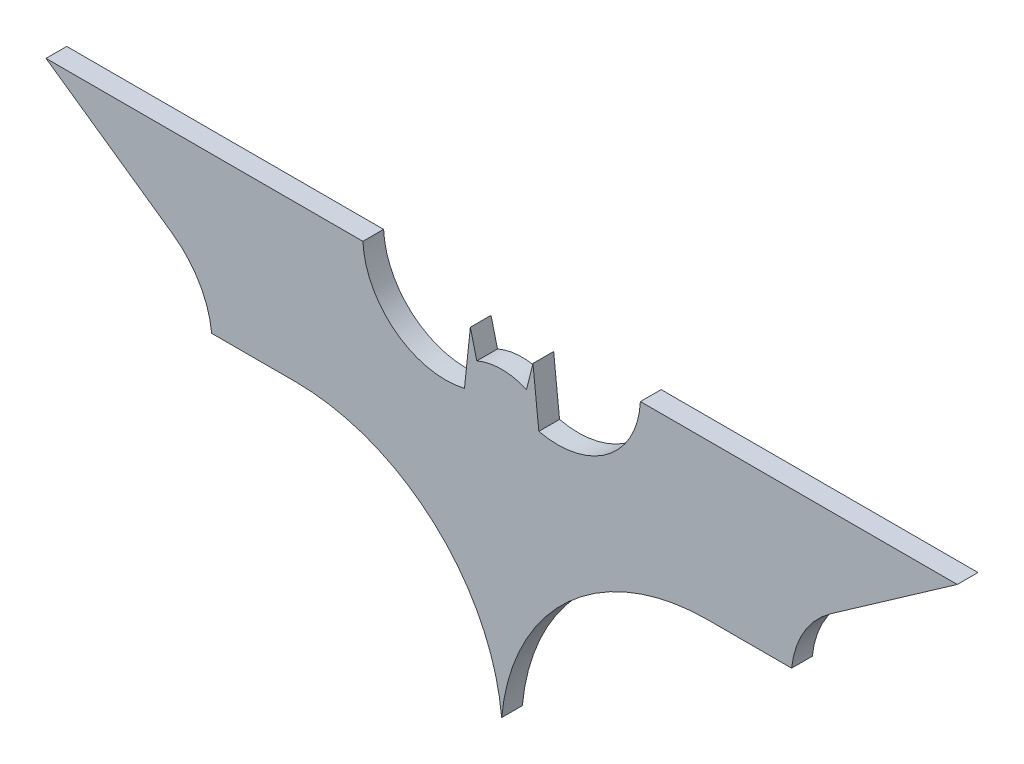
ISO-10303-21;
HEADER;
FILE_DESCRIPTION(('STEP AP214'),'2;1');
FILE_NAME('part.step','',(''),(''),'','','');
FILE_SCHEMA(('AUTOMOTIVE_DESIGN { 1 0 10303 214 1 1 1 1 }'));
ENDSEC;
DATA;
#1=APPLICATION_CONTEXT('core data for automotive mechanical design processes');
#2=APPLICATION_PROTOCOL_DEFINITION('international standard','automotive_design',2000,#1);
#3=PRODUCT_CONTEXT('',#1,'mechanical');
#4=PRODUCT('Part','Part','',(#3));
#5=PRODUCT_RELATED_PRODUCT_CATEGORY('part','',(#4));
#6=PRODUCT_DEFINITION_FORMATION('','',#4);
#7=PRODUCT_DEFINITION_CONTEXT('part definition',#1,'design');
#8=PRODUCT_DEFINITION('design','',#6,#7);
#9=PRODUCT_DEFINITION_SHAPE('','',#8);
#10=(LENGTH_UNIT() NAMED_UNIT(*) SI_UNIT(.MILLI.,.METRE.));
#11=(NAMED_UNIT(*) PLANE_ANGLE_UNIT() SI_UNIT($,.RADIAN.));
#12=(NAMED_UNIT(*) SI_UNIT($,.STERADIAN.) SOLID_ANGLE_UNIT());
#13=UNCERTAINTY_MEASURE_WITH_UNIT(LENGTH_MEASURE(1.E-05),#10,'distance_accuracy_value','');
#14=(GEOMETRIC_REPRESENTATION_CONTEXT(3) GLOBAL_UNCERTAINTY_ASSIGNED_CONTEXT((#13)) GLOBAL_UNIT_ASSIGNED_CONTEXT((#10,
#11,#12)) REPRESENTATION_CONTEXT('',''));
#15=CARTESIAN_POINT('',(0.,0.,0.));
#16=DIRECTION('',(0.,0.,1.));
#17=DIRECTION('',(1.,0.,0.));
#18=AXIS2_PLACEMENT_3D('',#15,#16,#17);
#19=CARTESIAN_POINT('',(27.0477038578762,51.952954933437,10.));
#20=DIRECTION('',(0.,0.,-1.));
#21=DIRECTION('',(-1.,0.,0.));
#22=AXIS2_PLACEMENT_3D('',#19,#20,#21);
#23=CYLINDRICAL_SURFACE('',#22,40.);
#24=CARTESIAN_POINT('',(27.0477038578762,51.952954933437,0.));
#25=DIRECTION('',(0.,0.,-1.));
#26=DIRECTION('',(-1.,0.,0.));
#27=AXIS2_PLACEMENT_3D('',#24,#25,#26);
#28=CIRCLE('',#27,40.);
#29=CARTESIAN_POINT('',(67.,50.,0.));
#30=VERTEX_POINT('',#29);
#31=CARTESIAN_POINT('',(17.9555477904942,13.,0.));
#32=VERTEX_POINT('',#31);
#33=EDGE_CURVE('E187',#30,#32,#28,.T.);
#34=ORIENTED_EDGE('',*,*,#33,.T.);
#35=DIRECTION('',(0.,0.,-1.));
#36=VECTOR('',#35,1.);
#37=CARTESIAN_POINT('',(17.9555477904942,13.,10.));
#38=LINE('',#37,#36);
#39=CARTESIAN_POINT('',(17.9555477904942,13.,10.));
#40=VERTEX_POINT('',#39);
#41=EDGE_CURVE('E11',#40,#32,#38,.T.);
#42=ORIENTED_EDGE('',*,*,#41,.F.);
#43=CARTESIAN_POINT('',(27.0477038578762,51.952954933437,10.));
#44=DIRECTION('',(0.,0.,-1.));
#45=DIRECTION('',(-1.,0.,0.));
#46=AXIS2_PLACEMENT_3D('',#43,#44,#45);
#47=CIRCLE('',#46,40.);
#48=CARTESIAN_POINT('',(67.,50.,10.));
#49=VERTEX_POINT('',#48);
#50=EDGE_CURVE('E219',#49,#40,#47,.T.);
#51=ORIENTED_EDGE('',*,*,#50,.F.);
#52=DIRECTION('',(0.,0.,-1.));
#53=VECTOR('',#52,1.);
#54=CARTESIAN_POINT('',(67.,50.,10.));
#55=LINE('',#54,#53);
#56=EDGE_CURVE('E183',#49,#30,#55,.T.);
#57=ORIENTED_EDGE('',*,*,#56,.T.);
#58=EDGE_LOOP('',(#34,#42,#51,#57));
#59=FACE_BOUND('',#58,.T.);
#60=ADVANCED_FACE('F37',(#59),#23,.F.);
#61=CARTESIAN_POINT('',(17.9555477904942,13.,10.));
#62=DIRECTION('',(-0.994521895368273,-0.104528463267658,0.));
#63=DIRECTION('',(0.104528463267658,-0.994521895368273,0.));
#64=AXIS2_PLACEMENT_3D('',#61,#62,#63);
#65=PLANE('',#64);
#66=DIRECTION('',(-0.104528463267658,0.994521895368273,0.));
#67=VECTOR('',#66,1.);
#68=CARTESIAN_POINT('',(17.9555477904942,13.,0.));
#69=LINE('',#68,#67);
#70=CARTESIAN_POINT('',(15.1177334383209,40.,0.));
#71=VERTEX_POINT('',#70);
#72=EDGE_CURVE('E190',#32,#71,#69,.T.);
#73=ORIENTED_EDGE('',*,*,#72,.T.);
#74=DIRECTION('',(0.,0.,-1.));
#75=VECTOR('',#74,1.);
#76=CARTESIAN_POINT('',(15.1177334383209,40.,10.));
#77=LINE('',#76,#75);
#78=CARTESIAN_POINT('',(15.1177334383209,40.,10.));
#79=VERTEX_POINT('',#78);
#80=EDGE_CURVE('E45',#79,#71,#77,.T.);
#81=ORIENTED_EDGE('',*,*,#80,.F.);
#82=DIRECTION('',(-0.104528463267658,0.994521895368273,0.));
#83=VECTOR('',#82,1.);
#84=CARTESIAN_POINT('',(17.9555477904942,13.,10.));
#85=LINE('',#84,#83);
#86=EDGE_CURVE('E123',#40,#79,#85,.T.);
#87=ORIENTED_EDGE('',*,*,#86,.F.);
#88=ORIENTED_EDGE('',*,*,#41,.T.);
#89=EDGE_LOOP('',(#73,#81,#87,#88));
#90=FACE_BOUND('',#89,.T.);
#91=ADVANCED_FACE('F322',(#90),#65,.F.);
#92=CARTESIAN_POINT('',(15.1177334383209,40.,10.));
#93=DIRECTION('',(0.970295726275999,-0.241921895599658,0.));
#94=DIRECTION('',(0.241921895599658,0.970295726275999,0.));
#95=AXIS2_PLACEMENT_3D('',#92,#93,#94);
#96=PLANE('',#95);
#97=DIRECTION('',(-0.241921895599658,-0.970295726275999,0.));
#98=VECTOR('',#97,1.);
#99=CARTESIAN_POINT('',(15.1177334383209,40.,0.));
#100=LINE('',#99,#98);
#101=CARTESIAN_POINT('',(12.,27.495454169735,0.));
#102=VERTEX_POINT('',#101);
#103=EDGE_CURVE('E192',#71,#102,#100,.T.);
#104=ORIENTED_EDGE('',*,*,#103,.T.);
#105=DIRECTION('',(0.,0.,-1.));
#106=VECTOR('',#105,1.);
#107=CARTESIAN_POINT('',(12.,27.495454169735,10.));
#108=LINE('',#107,#106);
#109=CARTESIAN_POINT('',(12.,27.495454169735,10.));
#110=VERTEX_POINT('',#109);
#111=EDGE_CURVE('E253',#110,#102,#108,.T.);
#112=ORIENTED_EDGE('',*,*,#111,.F.);
#113=DIRECTION('',(-0.241921895599658,-0.970295726275999,0.));
#114=VECTOR('',#113,1.);
#115=CARTESIAN_POINT('',(15.1177334383209,40.,10.));
#116=LINE('',#115,#114);
#117=EDGE_CURVE('E261',#79,#110,#116,.T.);
#118=ORIENTED_EDGE('',*,*,#117,.F.);
#119=ORIENTED_EDGE('',*,*,#80,.T.);
#120=EDGE_LOOP('',(#104,#112,#118,#119));
#121=FACE_BOUND('',#120,.T.);
#122=ADVANCED_FACE('F259',(#121),#96,.F.);
#123=CARTESIAN_POINT('',(0.,0.,10.));
#124=DIRECTION('',(0.,0.,-1.));
#125=DIRECTION('',(-1.,0.,0.));
#126=AXIS2_PLACEMENT_3D('',#123,#124,#125);
#127=CYLINDRICAL_SURFACE('',#126,30.);
#128=CARTESIAN_POINT('',(0.,0.,0.));
#129=DIRECTION('',(0.,0.,1.));
#130=DIRECTION('',(1.,0.,0.));
#131=AXIS2_PLACEMENT_3D('',#128,#129,#130);
#132=CIRCLE('',#131,30.);
#133=CARTESIAN_POINT('',(-12.,27.495454169735,0.));
#134=VERTEX_POINT('',#133);
#135=EDGE_CURVE('E194',#102,#134,#132,.T.);
#136=ORIENTED_EDGE('',*,*,#135,.T.);
#137=DIRECTION('',(0.,0.,-1.));
#138=VECTOR('',#137,1.);
#139=CARTESIAN_POINT('',(-12.,27.495454169735,10.));
#140=LINE('',#139,#138);
#141=CARTESIAN_POINT('',(-12.,27.495454169735,10.));
#142=VERTEX_POINT('',#141);
#143=EDGE_CURVE('E250',#142,#134,#140,.T.);
#144=ORIENTED_EDGE('',*,*,#143,.F.);
#145=CARTESIAN_POINT('',(0.,0.,10.));
#146=DIRECTION('',(0.,0.,1.));
#147=DIRECTION('',(1.,0.,0.));
#148=AXIS2_PLACEMENT_3D('',#145,#146,#147);
#149=CIRCLE('',#148,30.);
#150=EDGE_CURVE('E279',#110,#142,#149,.T.);
#151=ORIENTED_EDGE('',*,*,#150,.F.);
#152=ORIENTED_EDGE('',*,*,#111,.T.);
#153=EDGE_LOOP('',(#136,#144,#151,#152));
#154=FACE_BOUND('',#153,.T.);
#155=ADVANCED_FACE('F270',(#154),#127,.T.);
#156=CARTESIAN_POINT('',(-15.1177334383208,40.,10.));
#157=DIRECTION('',(-0.970295726275999,-0.241921895599658,0.));
#158=DIRECTION('',(0.241921895599658,-0.970295726275999,0.));
#159=AXIS2_PLACEMENT_3D('',#156,#157,#158);
#160=PLANE('',#159);
#161=DIRECTION('',(-0.241921895599658,0.970295726275999,0.));
#162=VECTOR('',#161,1.);
#163=CARTESIAN_POINT('',(-15.1177334383208,40.,0.));
#164=LINE('',#163,#162);
#165=CARTESIAN_POINT('',(-15.1177334383208,40.,0.));
#166=VERTEX_POINT('',#165);
#167=EDGE_CURVE('E196',#134,#166,#164,.T.);
#168=ORIENTED_EDGE('',*,*,#167,.T.);
#169=DIRECTION('',(0.,0.,-1.));
#170=VECTOR('',#169,1.);
#171=CARTESIAN_POINT('',(-15.1177334383208,40.,10.));
#172=LINE('',#171,#170);
#173=CARTESIAN_POINT('',(-15.1177334383208,40.,10.));
#174=VERTEX_POINT('',#173);
#175=EDGE_CURVE('E247',#174,#166,#172,.T.);
#176=ORIENTED_EDGE('',*,*,#175,.F.);
#177=DIRECTION('',(-0.241921895599658,0.970295726275999,0.));
#178=VECTOR('',#177,1.);
#179=CARTESIAN_POINT('',(-15.1177334383208,40.,10.));
#180=LINE('',#179,#178);
#181=EDGE_CURVE('E276',#142,#174,#180,.T.);
#182=ORIENTED_EDGE('',*,*,#181,.F.);
#183=ORIENTED_EDGE('',*,*,#143,.T.);
#184=EDGE_LOOP('',(#168,#176,#182,#183));
#185=FACE_BOUND('',#184,.T.);
#186=ADVANCED_FACE('F274',(#185),#160,.F.);
#187=CARTESIAN_POINT('',(-17.9555477904942,13.,10.));
#188=DIRECTION('',(0.994521895368273,-0.104528463267658,0.));
#189=DIRECTION('',(0.104528463267658,0.994521895368273,0.));
#190=AXIS2_PLACEMENT_3D('',#187,#188,#189);
#191=PLANE('',#190);
#192=DIRECTION('',(-0.104528463267658,-0.994521895368273,0.));
#193=VECTOR('',#192,1.);
#194=CARTESIAN_POINT('',(-17.9555477904942,13.,0.));
#195=LINE('',#194,#193);
#196=CARTESIAN_POINT('',(-17.9555477904942,13.,0.));
#197=VERTEX_POINT('',#196);
#198=EDGE_CURVE('E198',#166,#197,#195,.T.);
#199=ORIENTED_EDGE('',*,*,#198,.T.);
#200=DIRECTION('',(0.,0.,-1.));
#201=VECTOR('',#200,1.);
#202=CARTESIAN_POINT('',(-17.9555477904942,13.,10.));
#203=LINE('',#202,#201);
#204=CARTESIAN_POINT('',(-17.9555477904942,13.,10.));
#205=VERTEX_POINT('',#204);
#206=EDGE_CURVE('E244',#205,#197,#203,.T.);
#207=ORIENTED_EDGE('',*,*,#206,.F.);
#208=DIRECTION('',(-0.104528463267658,-0.994521895368273,0.));
#209=VECTOR('',#208,1.);
#210=CARTESIAN_POINT('',(-17.9555477904942,13.,10.));
#211=LINE('',#210,#209);
#212=EDGE_CURVE('E278',#174,#205,#211,.T.);
#213=ORIENTED_EDGE('',*,*,#212,.F.);
#214=ORIENTED_EDGE('',*,*,#175,.T.);
#215=EDGE_LOOP('',(#199,#207,#213,#214));
#216=FACE_BOUND('',#215,.T.);
#217=ADVANCED_FACE('F335',(#216),#191,.F.);
#218=CARTESIAN_POINT('',(-27.0477038578761,51.952954933437,10.));
#219=DIRECTION('',(0.,0.,-1.));
#220=DIRECTION('',(-1.,0.,0.));
#221=AXIS2_PLACEMENT_3D('',#218,#219,#220);
#222=CYLINDRICAL_SURFACE('',#221,40.);
#223=CARTESIAN_POINT('',(-27.0477038578761,51.952954933437,0.));
#224=DIRECTION('',(0.,0.,-1.));
#225=DIRECTION('',(1.,0.,0.));
#226=AXIS2_PLACEMENT_3D('',#223,#224,#225);
#227=CIRCLE('',#226,40.);
#228=CARTESIAN_POINT('',(-67.,50.,0.));
#229=VERTEX_POINT('',#228);
#230=EDGE_CURVE('E200',#197,#229,#227,.T.);
#231=ORIENTED_EDGE('',*,*,#230,.T.);
#232=DIRECTION('',(0.,0.,-1.));
#233=VECTOR('',#232,1.);
#234=CARTESIAN_POINT('',(-67.,50.,10.));
#235=LINE('',#234,#233);
#236=CARTESIAN_POINT('',(-67.,50.,10.));
#237=VERTEX_POINT('',#236);
#238=EDGE_CURVE('E241',#237,#229,#235,.T.);
#239=ORIENTED_EDGE('',*,*,#238,.F.);
#240=CARTESIAN_POINT('',(-27.0477038578761,51.952954933437,10.));
#241=DIRECTION('',(0.,0.,-1.));
#242=DIRECTION('',(1.,0.,0.));
#243=AXIS2_PLACEMENT_3D('',#240,#241,#242);
#244=CIRCLE('',#243,40.);
#245=EDGE_CURVE('E281',#205,#237,#244,.T.);
#246=ORIENTED_EDGE('',*,*,#245,.F.);
#247=ORIENTED_EDGE('',*,*,#206,.T.);
#248=EDGE_LOOP('',(#231,#239,#246,#247));
#249=FACE_BOUND('',#248,.T.);
#250=ADVANCED_FACE('F338',(#249),#222,.F.);
#251=CARTESIAN_POINT('',(-67.,50.,10.));
#252=DIRECTION('',(0.,-1.,0.));
#253=DIRECTION('',(1.,0.,0.));
#254=AXIS2_PLACEMENT_3D('',#251,#252,#253);
#255=PLANE('',#254);
#256=DIRECTION('',(-1.,0.,0.));
#257=VECTOR('',#256,1.);
#258=CARTESIAN_POINT('',(-67.,50.,0.));
#259=LINE('',#258,#257);
#260=CARTESIAN_POINT('',(-220.,50.,0.));
#261=VERTEX_POINT('',#260);
#262=EDGE_CURVE('E202',#229,#261,#259,.T.);
#263=ORIENTED_EDGE('',*,*,#262,.T.);
#264=DIRECTION('',(0.,0.,-1.));
#265=VECTOR('',#264,1.);
#266=CARTESIAN_POINT('',(-220.,50.,10.));
#267=LINE('',#266,#265);
#268=CARTESIAN_POINT('',(-220.,50.,10.));
#269=VERTEX_POINT('',#268);
#270=EDGE_CURVE('E238',#269,#261,#267,.T.);
#271=ORIENTED_EDGE('',*,*,#270,.F.);
#272=DIRECTION('',(-1.,0.,0.));
#273=VECTOR('',#272,1.);
#274=CARTESIAN_POINT('',(-67.,50.,10.));
#275=LINE('',#274,#273);
#276=EDGE_CURVE('E287',#237,#269,#275,.T.);
#277=ORIENTED_EDGE('',*,*,#276,.F.);
#278=ORIENTED_EDGE('',*,*,#238,.T.);
#279=EDGE_LOOP('',(#263,#271,#277,#278));
#280=FACE_BOUND('',#279,.T.);
#281=ADVANCED_FACE('F342',(#280),#255,.F.);
#282=CARTESIAN_POINT('',(-220.,50.,10.));
#283=DIRECTION('',(0.573576436351042,0.819152044288995,0.));
#284=DIRECTION('',(-0.819152044288995,0.573576436351042,0.));
#285=AXIS2_PLACEMENT_3D('',#282,#283,#284);
#286=PLANE('',#285);
#287=DIRECTION('',(0.819152044288995,-0.573576436351042,0.));
#288=VECTOR('',#287,1.);
#289=CARTESIAN_POINT('',(-220.,50.,0.));
#290=LINE('',#289,#288);
#291=CARTESIAN_POINT('',(-158.95253616354,7.25410563312683,0.));
#292=VERTEX_POINT('',#291);
#293=EDGE_CURVE('E204',#261,#292,#290,.T.);
#294=ORIENTED_EDGE('',*,*,#293,.T.);
#295=DIRECTION('',(0.,0.,-1.));
#296=VECTOR('',#295,1.);
#297=CARTESIAN_POINT('',(-158.95253616354,7.25410563312683,10.));
#298=LINE('',#297,#296);
#299=CARTESIAN_POINT('',(-158.95253616354,7.25410563312683,10.));
#300=VERTEX_POINT('',#299);
#301=EDGE_CURVE('E235',#300,#292,#298,.T.);
#302=ORIENTED_EDGE('',*,*,#301,.F.);
#303=DIRECTION('',(0.819152044288995,-0.573576436351042,0.));
#304=VECTOR('',#303,1.);
#305=CARTESIAN_POINT('',(-220.,50.,10.));
#306=LINE('',#305,#304);
#307=EDGE_CURVE('E289',#269,#300,#306,.T.);
#308=ORIENTED_EDGE('',*,*,#307,.F.);
#309=ORIENTED_EDGE('',*,*,#270,.T.);
#310=EDGE_LOOP('',(#294,#302,#308,#309));
#311=FACE_BOUND('',#310,.T.);
#312=ADVANCED_FACE('F346',(#311),#286,.F.);
#313=CARTESIAN_POINT('',(-184.763475799337,-29.6077363598778,10.));
#314=DIRECTION('',(0.,0.,-1.));
#315=DIRECTION('',(-1.,0.,0.));
#316=AXIS2_PLACEMENT_3D('',#313,#314,#315);
#317=CYLINDRICAL_SURFACE('',#316,44.9999999999999);
#318=CARTESIAN_POINT('',(-184.763475799337,-29.6077363598778,0.));
#319=DIRECTION('',(0.,0.,-1.));
#320=DIRECTION('',(-1.,0.,0.));
#321=AXIS2_PLACEMENT_3D('',#318,#319,#320);
#322=CIRCLE('',#321,44.9999999999999);
#323=CARTESIAN_POINT('',(-140.,-25.,0.));
#324=VERTEX_POINT('',#323);
#325=EDGE_CURVE('E206',#292,#324,#322,.T.);
#326=ORIENTED_EDGE('',*,*,#325,.T.);
#327=DIRECTION('',(0.,0.,-1.));
#328=VECTOR('',#327,1.);
#329=CARTESIAN_POINT('',(-140.,-25.,10.));
#330=LINE('',#329,#328);
#331=CARTESIAN_POINT('',(-140.,-25.,10.));
#332=VERTEX_POINT('',#331);
#333=EDGE_CURVE('E232',#332,#324,#330,.T.);
#334=ORIENTED_EDGE('',*,*,#333,.F.);
#335=CARTESIAN_POINT('',(-184.763475799337,-29.6077363598778,10.));
#336=DIRECTION('',(0.,0.,-1.));
#337=DIRECTION('',(-1.,0.,0.));
#338=AXIS2_PLACEMENT_3D('',#335,#336,#337);
#339=CIRCLE('',#338,44.9999999999999);
#340=EDGE_CURVE('E291',#300,#332,#339,.T.);
#341=ORIENTED_EDGE('',*,*,#340,.F.);
#342=ORIENTED_EDGE('',*,*,#301,.T.);
#343=EDGE_LOOP('',(#326,#334,#341,#342));
#344=FACE_BOUND('',#343,.T.);
#345=ADVANCED_FACE('F350',(#344),#317,.F.);
#346=CARTESIAN_POINT('',(-140.,-25.,10.));
#347=DIRECTION('',(0.,1.,0.));
#348=DIRECTION('',(-1.,0.,0.));
#349=AXIS2_PLACEMENT_3D('',#346,#347,#348);
#350=PLANE('',#349);
#351=DIRECTION('',(1.,0.,0.));
#352=VECTOR('',#351,1.);
#353=CARTESIAN_POINT('',(-140.,-25.,0.));
#354=LINE('',#353,#352);
#355=CARTESIAN_POINT('',(-99.5632241443499,-25.,0.));
#356=VERTEX_POINT('',#355);
#357=EDGE_CURVE('E208',#324,#356,#354,.T.);
#358=ORIENTED_EDGE('',*,*,#357,.T.);
#359=DIRECTION('',(0.,0.,-1.));
#360=VECTOR('',#359,1.);
#361=CARTESIAN_POINT('',(-99.5632241443499,-25.,10.));
#362=LINE('',#361,#360);
#363=CARTESIAN_POINT('',(-99.5632241443499,-25.,10.));
#364=VERTEX_POINT('',#363);
#365=EDGE_CURVE('E229',#364,#356,#362,.T.);
#366=ORIENTED_EDGE('',*,*,#365,.F.);
#367=DIRECTION('',(1.,0.,0.));
#368=VECTOR('',#367,1.);
#369=CARTESIAN_POINT('',(-140.,-25.,10.));
#370=LINE('',#369,#368);
#371=EDGE_CURVE('E293',#332,#364,#370,.T.);
#372=ORIENTED_EDGE('',*,*,#371,.F.);
#373=ORIENTED_EDGE('',*,*,#333,.T.);
#374=EDGE_LOOP('',(#358,#366,#372,#373));
#375=FACE_BOUND('',#374,.T.);
#376=ADVANCED_FACE('F354',(#375),#350,.F.);
#377=CARTESIAN_POINT('',(-99.5632241443499,-125.,10.));
#378=DIRECTION('',(0.,0.,-1.));
#379=DIRECTION('',(-1.,0.,0.));
#380=AXIS2_PLACEMENT_3D('',#377,#378,#379);
#381=CYLINDRICAL_SURFACE('',#380,100.);
#382=CARTESIAN_POINT('',(-99.5632241443499,-125.,0.));
#383=DIRECTION('',(0.,0.,-1.));
#384=DIRECTION('',(-1.,0.,0.));
#385=AXIS2_PLACEMENT_3D('',#382,#383,#384);
#386=CIRCLE('',#385,100.);
#387=CARTESIAN_POINT('',(0.,-115.663812449295,0.));
#388=VERTEX_POINT('',#387);
#389=EDGE_CURVE('E210',#356,#388,#386,.T.);
#390=ORIENTED_EDGE('',*,*,#389,.T.);
#391=DIRECTION('',(0.,0.,-1.));
#392=VECTOR('',#391,1.);
#393=CARTESIAN_POINT('',(0.,-115.663812449295,10.));
#394=LINE('',#393,#392);
#395=CARTESIAN_POINT('',(0.,-115.663812449295,10.));
#396=VERTEX_POINT('',#395);
#397=EDGE_CURVE('E226',#396,#388,#394,.T.);
#398=ORIENTED_EDGE('',*,*,#397,.F.);
#399=CARTESIAN_POINT('',(-99.5632241443499,-125.,10.));
#400=DIRECTION('',(0.,0.,-1.));
#401=DIRECTION('',(-1.,0.,0.));
#402=AXIS2_PLACEMENT_3D('',#399,#400,#401);
#403=CIRCLE('',#402,100.);
#404=EDGE_CURVE('E295',#364,#396,#403,.T.);
#405=ORIENTED_EDGE('',*,*,#404,.F.);
#406=ORIENTED_EDGE('',*,*,#365,.T.);
#407=EDGE_LOOP('',(#390,#398,#405,#406));
#408=FACE_BOUND('',#407,.T.);
#409=ADVANCED_FACE('F358',(#408),#381,.F.);
#410=CARTESIAN_POINT('',(99.5632241443499,-125.,10.));
#411=DIRECTION('',(0.,0.,-1.));
#412=DIRECTION('',(-1.,0.,0.));
#413=AXIS2_PLACEMENT_3D('',#410,#411,#412);
#414=CYLINDRICAL_SURFACE('',#413,100.);
#415=CARTESIAN_POINT('',(99.5632241443499,-125.,0.));
#416=DIRECTION('',(0.,0.,-1.));
#417=DIRECTION('',(1.,0.,0.));
#418=AXIS2_PLACEMENT_3D('',#415,#416,#417);
#419=CIRCLE('',#418,100.);
#420=CARTESIAN_POINT('',(99.5632241443499,-25.,0.));
#421=VERTEX_POINT('',#420);
#422=EDGE_CURVE('E212',#388,#421,#419,.T.);
#423=ORIENTED_EDGE('',*,*,#422,.T.);
#424=DIRECTION('',(0.,0.,-1.));
#425=VECTOR('',#424,1.);
#426=CARTESIAN_POINT('',(99.5632241443499,-25.,10.));
#427=LINE('',#426,#425);
#428=CARTESIAN_POINT('',(99.5632241443499,-25.,10.));
#429=VERTEX_POINT('',#428);
#430=EDGE_CURVE('E223',#429,#421,#427,.T.);
#431=ORIENTED_EDGE('',*,*,#430,.F.);
#432=CARTESIAN_POINT('',(99.5632241443499,-125.,10.));
#433=DIRECTION('',(0.,0.,-1.));
#434=DIRECTION('',(1.,0.,0.));
#435=AXIS2_PLACEMENT_3D('',#432,#433,#434);
#436=CIRCLE('',#435,100.);
#437=EDGE_CURVE('E297',#396,#429,#436,.T.);
#438=ORIENTED_EDGE('',*,*,#437,.F.);
#439=ORIENTED_EDGE('',*,*,#397,.T.);
#440=EDGE_LOOP('',(#423,#431,#438,#439));
#441=FACE_BOUND('',#440,.T.);
#442=ADVANCED_FACE('F303',(#441),#414,.F.);
#443=CARTESIAN_POINT('',(140.,-25.,10.));
#444=DIRECTION('',(0.,1.,0.));
#445=DIRECTION('',(-1.,0.,0.));
#446=AXIS2_PLACEMENT_3D('',#443,#444,#445);
#447=PLANE('',#446);
#448=DIRECTION('',(1.,0.,0.));
#449=VECTOR('',#448,1.);
#450=CARTESIAN_POINT('',(140.,-25.,0.));
#451=LINE('',#450,#449);
#452=CARTESIAN_POINT('',(140.,-25.,0.));
#453=VERTEX_POINT('',#452);
#454=EDGE_CURVE('E214',#421,#453,#451,.T.);
#455=ORIENTED_EDGE('',*,*,#454,.T.);
#456=DIRECTION('',(0.,0.,-1.));
#457=VECTOR('',#456,1.);
#458=CARTESIAN_POINT('',(140.,-25.,10.));
#459=LINE('',#458,#457);
#460=CARTESIAN_POINT('',(140.,-25.,10.));
#461=VERTEX_POINT('',#460);
#462=EDGE_CURVE('E178',#461,#453,#459,.T.);
#463=ORIENTED_EDGE('',*,*,#462,.F.);
#464=DIRECTION('',(1.,0.,0.));
#465=VECTOR('',#464,1.);
#466=CARTESIAN_POINT('',(140.,-25.,10.));
#467=LINE('',#466,#465);
#468=EDGE_CURVE('E169',#429,#461,#467,.T.);
#469=ORIENTED_EDGE('',*,*,#468,.F.);
#470=ORIENTED_EDGE('',*,*,#430,.T.);
#471=EDGE_LOOP('',(#455,#463,#469,#470));
#472=FACE_BOUND('',#471,.T.);
#473=ADVANCED_FACE('F307',(#472),#447,.F.);
#474=CARTESIAN_POINT('',(184.763475799337,-29.6077363598778,10.));
#475=DIRECTION('',(0.,0.,-1.));
#476=DIRECTION('',(-1.,0.,0.));
#477=AXIS2_PLACEMENT_3D('',#474,#475,#476);
#478=CYLINDRICAL_SURFACE('',#477,45.);
#479=CARTESIAN_POINT('',(184.763475799337,-29.6077363598778,0.));
#480=DIRECTION('',(0.,0.,-1.));
#481=DIRECTION('',(1.,0.,0.));
#482=AXIS2_PLACEMENT_3D('',#479,#480,#481);
#483=CIRCLE('',#482,45.);
#484=CARTESIAN_POINT('',(158.95253616354,7.25410563312692,0.));
#485=VERTEX_POINT('',#484);
#486=EDGE_CURVE('E177',#453,#485,#483,.T.);
#487=ORIENTED_EDGE('',*,*,#486,.T.);
#488=DIRECTION('',(0.,0.,-1.));
#489=VECTOR('',#488,1.);
#490=CARTESIAN_POINT('',(158.95253616354,7.25410563312692,10.));
#491=LINE('',#490,#489);
#492=CARTESIAN_POINT('',(158.95253616354,7.25410563312692,10.));
#493=VERTEX_POINT('',#492);
#494=EDGE_CURVE('E174',#493,#485,#491,.T.);
#495=ORIENTED_EDGE('',*,*,#494,.F.);
#496=CARTESIAN_POINT('',(184.763475799337,-29.6077363598778,10.));
#497=DIRECTION('',(0.,0.,-1.));
#498=DIRECTION('',(1.,0.,0.));
#499=AXIS2_PLACEMENT_3D('',#496,#497,#498);
#500=CIRCLE('',#499,45.);
#501=EDGE_CURVE('E163',#461,#493,#500,.T.);
#502=ORIENTED_EDGE('',*,*,#501,.F.);
#503=ORIENTED_EDGE('',*,*,#462,.T.);
#504=EDGE_LOOP('',(#487,#495,#502,#503));
#505=FACE_BOUND('',#504,.T.);
#506=ADVANCED_FACE('F175',(#505),#478,.F.);
#507=CARTESIAN_POINT('',(220.,50.,10.));
#508=DIRECTION('',(-0.573576436351041,0.819152044288995,0.));
#509=DIRECTION('',(-0.819152044288995,-0.573576436351041,0.));
#510=AXIS2_PLACEMENT_3D('',#507,#508,#509);
#511=PLANE('',#510);
#512=DIRECTION('',(0.819152044288995,0.573576436351042,0.));
#513=VECTOR('',#512,1.);
#514=CARTESIAN_POINT('',(220.,50.,0.));
#515=LINE('',#514,#513);
#516=CARTESIAN_POINT('',(220.,50.,0.));
#517=VERTEX_POINT('',#516);
#518=EDGE_CURVE('E109',#485,#517,#515,.T.);
#519=ORIENTED_EDGE('',*,*,#518,.T.);
#520=DIRECTION('',(0.,0.,-1.));
#521=VECTOR('',#520,1.);
#522=CARTESIAN_POINT('',(220.,50.,10.));
#523=LINE('',#522,#521);
#524=CARTESIAN_POINT('',(220.,50.,10.));
#525=VERTEX_POINT('',#524);
#526=EDGE_CURVE('E179',#525,#517,#523,.T.);
#527=ORIENTED_EDGE('',*,*,#526,.F.);
#528=DIRECTION('',(0.819152044288995,0.573576436351042,0.));
#529=VECTOR('',#528,1.);
#530=CARTESIAN_POINT('',(220.,50.,10.));
#531=LINE('',#530,#529);
#532=EDGE_CURVE('E167',#493,#525,#531,.T.);
#533=ORIENTED_EDGE('',*,*,#532,.F.);
#534=ORIENTED_EDGE('',*,*,#494,.T.);
#535=EDGE_LOOP('',(#519,#527,#533,#534));
#536=FACE_BOUND('',#535,.T.);
#537=ADVANCED_FACE('F181',(#536),#511,.F.);
#538=CARTESIAN_POINT('',(67.,50.,10.));
#539=DIRECTION('',(0.,-1.,0.));
#540=DIRECTION('',(0.,0.,-1.));
#541=AXIS2_PLACEMENT_3D('',#538,#539,#540);
#542=PLANE('',#541);
#543=DIRECTION('',(-1.,0.,0.));
#544=VECTOR('',#543,1.);
#545=CARTESIAN_POINT('',(67.,50.,0.));
#546=LINE('',#545,#544);
#547=EDGE_CURVE('E115',#517,#30,#546,.T.);
#548=ORIENTED_EDGE('',*,*,#547,.T.);
#549=ORIENTED_EDGE('',*,*,#56,.F.);
#550=DIRECTION('',(-1.,0.,0.));
#551=VECTOR('',#550,1.);
#552=CARTESIAN_POINT('',(67.,50.,10.));
#553=LINE('',#552,#551);
#554=EDGE_CURVE('E53',#525,#49,#553,.T.);
#555=ORIENTED_EDGE('',*,*,#554,.F.);
#556=ORIENTED_EDGE('',*,*,#526,.T.);
#557=EDGE_LOOP('',(#548,#549,#555,#556));
#558=FACE_BOUND('',#557,.T.);
#559=ADVANCED_FACE('F311',(#558),#542,.F.);
#560=CARTESIAN_POINT('',(27.0477038578762,51.952954933437,10.));
#561=DIRECTION('',(0.,0.,-1.));
#562=DIRECTION('',(-1.,0.,0.));
#563=AXIS2_PLACEMENT_3D('',#560,#561,#562);
#564=PLANE('',#563);
#565=ORIENTED_EDGE('',*,*,#50,.T.);
#566=ORIENTED_EDGE('',*,*,#86,.T.);
#567=ORIENTED_EDGE('',*,*,#117,.T.);
#568=ORIENTED_EDGE('',*,*,#150,.T.);
#569=ORIENTED_EDGE('',*,*,#181,.T.);
#570=ORIENTED_EDGE('',*,*,#212,.T.);
#571=ORIENTED_EDGE('',*,*,#245,.T.);
#572=ORIENTED_EDGE('',*,*,#276,.T.);
#573=ORIENTED_EDGE('',*,*,#307,.T.);
#574=ORIENTED_EDGE('',*,*,#340,.T.);
#575=ORIENTED_EDGE('',*,*,#371,.T.);
#576=ORIENTED_EDGE('',*,*,#404,.T.);
#577=ORIENTED_EDGE('',*,*,#437,.T.);
#578=ORIENTED_EDGE('',*,*,#468,.T.);
#579=ORIENTED_EDGE('',*,*,#501,.T.);
#580=ORIENTED_EDGE('',*,*,#532,.T.);
#581=ORIENTED_EDGE('',*,*,#554,.T.);
#582=EDGE_LOOP('',(#565,#566,#567,#568,#569,#570,#571,#572,#573,#574,#575,#576,#577,#578,#579,
#580,#581));
#583=FACE_BOUND('',#582,.T.);
#584=ADVANCED_FACE('F165',(#583),#564,.F.);
#585=CARTESIAN_POINT('',(27.0477038578762,51.952954933437,0.));
#586=DIRECTION('',(0.,0.,-1.));
#587=DIRECTION('',(-1.,0.,0.));
#588=AXIS2_PLACEMENT_3D('',#585,#586,#587);
#589=PLANE('',#588);
#590=ORIENTED_EDGE('',*,*,#33,.F.);
#591=ORIENTED_EDGE('',*,*,#547,.F.);
#592=ORIENTED_EDGE('',*,*,#518,.F.);
#593=ORIENTED_EDGE('',*,*,#486,.F.);
#594=ORIENTED_EDGE('',*,*,#454,.F.);
#595=ORIENTED_EDGE('',*,*,#422,.F.);
#596=ORIENTED_EDGE('',*,*,#389,.F.);
#597=ORIENTED_EDGE('',*,*,#357,.F.);
#598=ORIENTED_EDGE('',*,*,#325,.F.);
#599=ORIENTED_EDGE('',*,*,#293,.F.);
#600=ORIENTED_EDGE('',*,*,#262,.F.);
#601=ORIENTED_EDGE('',*,*,#230,.F.);
#602=ORIENTED_EDGE('',*,*,#198,.F.);
#603=ORIENTED_EDGE('',*,*,#167,.F.);
#604=ORIENTED_EDGE('',*,*,#135,.F.);
#605=ORIENTED_EDGE('',*,*,#103,.F.);
#606=ORIENTED_EDGE('',*,*,#72,.F.);
#607=EDGE_LOOP('',(#590,#591,#592,#593,#594,#595,#596,#597,#598,#599,#600,#601,#602,#603,#604,
#605,#606));
#608=FACE_BOUND('',#607,.T.);
#609=ADVANCED_FACE('F265',(#608),#589,.T.);
#610=CLOSED_SHELL('',(#60,#91,#122,#155,#186,#217,#250,#281,#312,#345,#376,#409,#442,#473,#506,
#537,#559,#584,#609));
#611=MANIFOLD_SOLID_BREP('B2',#610);
#612=ADVANCED_BREP_SHAPE_REPRESENTATION('',(#18,#611),#14);
#613=SHAPE_DEFINITION_REPRESENTATION(#9,#612);
ENDSEC;
END-ISO-10303-21;
